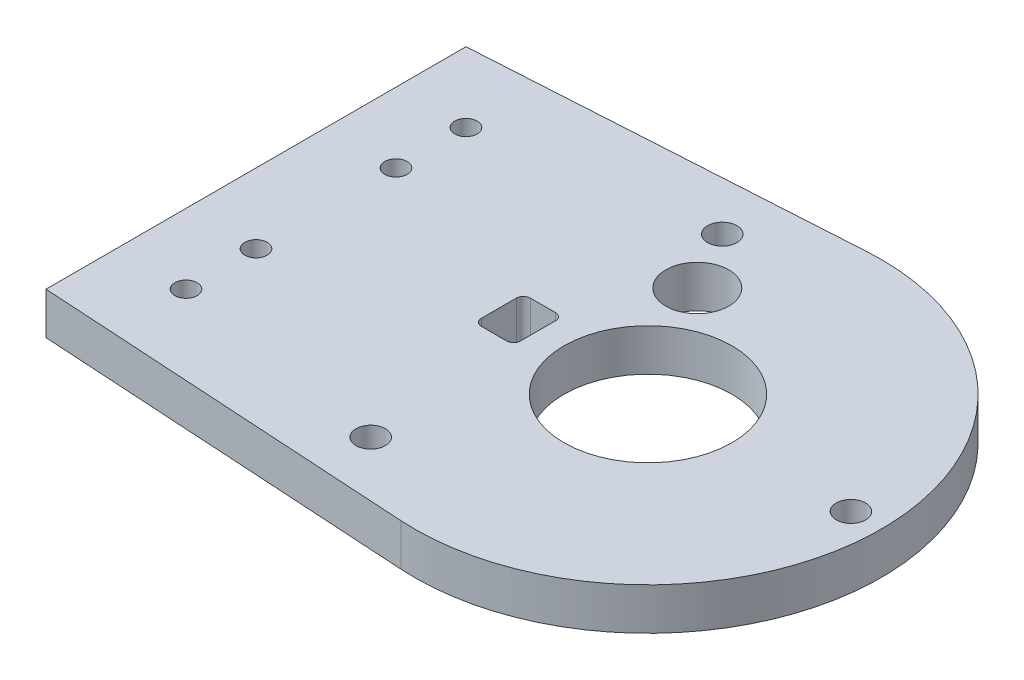
ISO-10303-21;
HEADER;
FILE_DESCRIPTION(('STEP AP214'),'2;1');
FILE_NAME('part.step','',(''),(''),'','','');
FILE_SCHEMA(('AUTOMOTIVE_DESIGN { 1 0 10303 214 1 1 1 1 }'));
ENDSEC;
DATA;
#1=APPLICATION_CONTEXT('core data for automotive mechanical design processes');
#2=APPLICATION_PROTOCOL_DEFINITION('international standard','automotive_design',2000,#1);
#3=PRODUCT_CONTEXT('',#1,'mechanical');
#4=PRODUCT('Part','Part','',(#3));
#5=PRODUCT_RELATED_PRODUCT_CATEGORY('part','',(#4));
#6=PRODUCT_DEFINITION_FORMATION('','',#4);
#7=PRODUCT_DEFINITION_CONTEXT('part definition',#1,'design');
#8=PRODUCT_DEFINITION('design','',#6,#7);
#9=PRODUCT_DEFINITION_SHAPE('','',#8);
#10=(LENGTH_UNIT() NAMED_UNIT(*) SI_UNIT(.MILLI.,.METRE.));
#11=(NAMED_UNIT(*) PLANE_ANGLE_UNIT() SI_UNIT($,.RADIAN.));
#12=(NAMED_UNIT(*) SI_UNIT($,.STERADIAN.) SOLID_ANGLE_UNIT());
#13=UNCERTAINTY_MEASURE_WITH_UNIT(LENGTH_MEASURE(1.E-05),#10,'distance_accuracy_value','');
#14=(GEOMETRIC_REPRESENTATION_CONTEXT(3) GLOBAL_UNCERTAINTY_ASSIGNED_CONTEXT((#13)) GLOBAL_UNIT_ASSIGNED_CONTEXT((#10,
#11,#12)) REPRESENTATION_CONTEXT('',''));
#15=CARTESIAN_POINT('',(0.,0.,0.));
#16=DIRECTION('',(0.,0.,1.));
#17=DIRECTION('',(1.,0.,0.));
#18=AXIS2_PLACEMENT_3D('',#15,#16,#17);
#19=CARTESIAN_POINT('',(-56.,6.,30.));
#20=DIRECTION('',(0.0608129390413845,0.,-0.998149180456082));
#21=DIRECTION('',(-0.998149180456082,0.,-0.0608129390413845));
#22=AXIS2_PLACEMENT_3D('',#19,#20,#21);
#23=PLANE('',#22);
#24=DIRECTION('',(0.998149180456082,0.,0.0608129390413845));
#25=VECTOR('',#24,1.);
#26=CARTESIAN_POINT('',(-56.,0.,30.));
#27=LINE('',#26,#25);
#28=CARTESIAN_POINT('',(-56.,0.,30.));
#29=VERTEX_POINT('',#28);
#30=CARTESIAN_POINT('',(-2.02811151703019,0.,33.2882751682104));
#31=VERTEX_POINT('',#30);
#32=EDGE_CURVE('E158',#29,#31,#27,.T.);
#33=ORIENTED_EDGE('',*,*,#32,.T.);
#34=DIRECTION('',(0.,-1.,0.));
#35=VECTOR('',#34,1.);
#36=CARTESIAN_POINT('',(-2.02811151703019,6.,33.2882751682104));
#37=LINE('',#36,#35);
#38=CARTESIAN_POINT('',(-2.02811151703019,6.,33.2882751682104));
#39=VERTEX_POINT('',#38);
#40=EDGE_CURVE('E137',#39,#31,#37,.T.);
#41=ORIENTED_EDGE('',*,*,#40,.F.);
#42=DIRECTION('',(0.998149180456082,0.,0.0608129390413845));
#43=VECTOR('',#42,1.);
#44=CARTESIAN_POINT('',(-56.,6.,30.));
#45=LINE('',#44,#43);
#46=CARTESIAN_POINT('',(-56.,6.,30.));
#47=VERTEX_POINT('',#46);
#48=EDGE_CURVE('E145',#47,#39,#45,.T.);
#49=ORIENTED_EDGE('',*,*,#48,.F.);
#50=DIRECTION('',(0.,-1.,0.));
#51=VECTOR('',#50,1.);
#52=CARTESIAN_POINT('',(-56.,6.,30.));
#53=LINE('',#52,#51);
#54=EDGE_CURVE('E319',#47,#29,#53,.T.);
#55=ORIENTED_EDGE('',*,*,#54,.T.);
#56=EDGE_LOOP('',(#33,#41,#49,#55));
#57=FACE_BOUND('',#56,.T.);
#58=ADVANCED_FACE('F43',(#57),#23,.F.);
#59=CARTESIAN_POINT('',(0.,6.,0.));
#60=DIRECTION('',(0.,-1.,0.));
#61=DIRECTION('',(0.,0.,-1.));
#62=AXIS2_PLACEMENT_3D('',#59,#60,#61);
#63=CYLINDRICAL_SURFACE('',#62,33.35);
#64=CARTESIAN_POINT('',(0.,0.,0.));
#65=DIRECTION('',(0.,1.,0.));
#66=DIRECTION('',(0.,0.,-1.));
#67=AXIS2_PLACEMENT_3D('',#64,#65,#66);
#68=CIRCLE('',#67,33.35);
#69=CARTESIAN_POINT('',(-2.02811151703017,0.,-33.2882751682103));
#70=VERTEX_POINT('',#69);
#71=EDGE_CURVE('E322',#31,#70,#68,.T.);
#72=ORIENTED_EDGE('',*,*,#71,.T.);
#73=DIRECTION('',(0.,-1.,0.));
#74=VECTOR('',#73,1.);
#75=CARTESIAN_POINT('',(-2.02811151703017,6.,-33.2882751682103));
#76=LINE('',#75,#74);
#77=CARTESIAN_POINT('',(-2.02811151703017,6.,-33.2882751682103));
#78=VERTEX_POINT('',#77);
#79=EDGE_CURVE('E140',#78,#70,#76,.T.);
#80=ORIENTED_EDGE('',*,*,#79,.F.);
#81=CARTESIAN_POINT('',(0.,6.,0.));
#82=DIRECTION('',(0.,1.,0.));
#83=DIRECTION('',(0.,0.,-1.));
#84=AXIS2_PLACEMENT_3D('',#81,#82,#83);
#85=CIRCLE('',#84,33.35);
#86=EDGE_CURVE('E133',#39,#78,#85,.T.);
#87=ORIENTED_EDGE('',*,*,#86,.F.);
#88=ORIENTED_EDGE('',*,*,#40,.T.);
#89=EDGE_LOOP('',(#72,#80,#87,#88));
#90=FACE_BOUND('',#89,.T.);
#91=ADVANCED_FACE('F135',(#90),#63,.T.);
#92=CARTESIAN_POINT('',(-2.02811151703017,6.,-33.2882751682103));
#93=DIRECTION('',(0.0608129390413845,0.,0.998149180456082));
#94=DIRECTION('',(0.998149180456082,0.,-0.0608129390413845));
#95=AXIS2_PLACEMENT_3D('',#92,#93,#94);
#96=PLANE('',#95);
#97=DIRECTION('',(-0.998149180456082,0.,0.0608129390413845));
#98=VECTOR('',#97,1.);
#99=CARTESIAN_POINT('',(-2.02811151703017,0.,-33.2882751682103));
#100=LINE('',#99,#98);
#101=CARTESIAN_POINT('',(-56.,0.,-30.));
#102=VERTEX_POINT('',#101);
#103=EDGE_CURVE('E325',#70,#102,#100,.T.);
#104=ORIENTED_EDGE('',*,*,#103,.T.);
#105=DIRECTION('',(0.,-1.,0.));
#106=VECTOR('',#105,1.);
#107=CARTESIAN_POINT('',(-56.,6.,-30.));
#108=LINE('',#107,#106);
#109=CARTESIAN_POINT('',(-56.,6.,-30.));
#110=VERTEX_POINT('',#109);
#111=EDGE_CURVE('E166',#110,#102,#108,.T.);
#112=ORIENTED_EDGE('',*,*,#111,.F.);
#113=DIRECTION('',(-0.998149180456082,0.,0.0608129390413845));
#114=VECTOR('',#113,1.);
#115=CARTESIAN_POINT('',(-2.02811151703017,6.,-33.2882751682103));
#116=LINE('',#115,#114);
#117=EDGE_CURVE('E144',#78,#110,#116,.T.);
#118=ORIENTED_EDGE('',*,*,#117,.F.);
#119=ORIENTED_EDGE('',*,*,#79,.T.);
#120=EDGE_LOOP('',(#104,#112,#118,#119));
#121=FACE_BOUND('',#120,.T.);
#122=ADVANCED_FACE('F341',(#121),#96,.F.);
#123=CARTESIAN_POINT('',(-56.,6.,30.));
#124=DIRECTION('',(1.,0.,0.));
#125=DIRECTION('',(0.,0.,-1.));
#126=AXIS2_PLACEMENT_3D('',#123,#124,#125);
#127=PLANE('',#126);
#128=DIRECTION('',(0.,0.,1.));
#129=VECTOR('',#128,1.);
#130=CARTESIAN_POINT('',(-56.,0.,30.));
#131=LINE('',#130,#129);
#132=EDGE_CURVE('E155',#102,#29,#131,.T.);
#133=ORIENTED_EDGE('',*,*,#132,.T.);
#134=ORIENTED_EDGE('',*,*,#54,.F.);
#135=DIRECTION('',(0.,0.,1.));
#136=VECTOR('',#135,1.);
#137=CARTESIAN_POINT('',(-56.,6.,30.));
#138=LINE('',#137,#136);
#139=EDGE_CURVE('E150',#110,#47,#138,.T.);
#140=ORIENTED_EDGE('',*,*,#139,.F.);
#141=ORIENTED_EDGE('',*,*,#111,.T.);
#142=EDGE_LOOP('',(#133,#134,#140,#141));
#143=FACE_BOUND('',#142,.T.);
#144=ADVANCED_FACE('F336',(#143),#127,.F.);
#145=CARTESIAN_POINT('',(0.,6.,0.));
#146=DIRECTION('',(0.,-1.,0.));
#147=DIRECTION('',(0.,0.,-1.));
#148=AXIS2_PLACEMENT_3D('',#145,#146,#147);
#149=PLANE('',#148);
#150=DIRECTION('',(0.,0.,-1.));
#151=VECTOR('',#150,1.);
#152=CARTESIAN_POINT('',(-15.7,6.,3.5));
#153=LINE('',#152,#151);
#154=CARTESIAN_POINT('',(-15.7,6.,2.5));
#155=VERTEX_POINT('',#154);
#156=CARTESIAN_POINT('',(-15.7,6.,-2.5));
#157=VERTEX_POINT('',#156);
#158=EDGE_CURVE('E216',#155,#157,#153,.T.);
#159=ORIENTED_EDGE('',*,*,#158,.F.);
#160=CARTESIAN_POINT('',(-16.7,6.,2.5));
#161=DIRECTION('',(0.,-1.,0.));
#162=DIRECTION('',(0.,0.,-1.));
#163=AXIS2_PLACEMENT_3D('',#160,#161,#162);
#164=CIRCLE('',#163,1.);
#165=CARTESIAN_POINT('',(-16.7,6.,3.5));
#166=VERTEX_POINT('',#165);
#167=EDGE_CURVE('E193',#155,#166,#164,.T.);
#168=ORIENTED_EDGE('',*,*,#167,.T.);
#169=DIRECTION('',(1.,0.,0.));
#170=VECTOR('',#169,1.);
#171=CARTESIAN_POINT('',(-15.7,6.,3.5));
#172=LINE('',#171,#170);
#173=CARTESIAN_POINT('',(-20.3,6.,3.5));
#174=VERTEX_POINT('',#173);
#175=EDGE_CURVE('E226',#174,#166,#172,.T.);
#176=ORIENTED_EDGE('',*,*,#175,.F.);
#177=CARTESIAN_POINT('',(-20.3,6.,2.5));
#178=DIRECTION('',(0.,-1.,0.));
#179=DIRECTION('',(0.,0.,-1.));
#180=AXIS2_PLACEMENT_3D('',#177,#178,#179);
#181=CIRCLE('',#180,1.);
#182=CARTESIAN_POINT('',(-21.3,6.,2.5));
#183=VERTEX_POINT('',#182);
#184=EDGE_CURVE('E199',#174,#183,#181,.T.);
#185=ORIENTED_EDGE('',*,*,#184,.T.);
#186=DIRECTION('',(0.,0.,1.));
#187=VECTOR('',#186,1.);
#188=CARTESIAN_POINT('',(-21.3,6.,3.5));
#189=LINE('',#188,#187);
#190=CARTESIAN_POINT('',(-21.3,6.,-2.5));
#191=VERTEX_POINT('',#190);
#192=EDGE_CURVE('E377',#191,#183,#189,.T.);
#193=ORIENTED_EDGE('',*,*,#192,.F.);
#194=CARTESIAN_POINT('',(-20.3,6.,-2.5));
#195=DIRECTION('',(0.,-1.,0.));
#196=DIRECTION('',(0.,0.,-1.));
#197=AXIS2_PLACEMENT_3D('',#194,#195,#196);
#198=CIRCLE('',#197,1.);
#199=CARTESIAN_POINT('',(-20.3,6.,-3.5));
#200=VERTEX_POINT('',#199);
#201=EDGE_CURVE('E205',#191,#200,#198,.T.);
#202=ORIENTED_EDGE('',*,*,#201,.T.);
#203=DIRECTION('',(-1.,0.,0.));
#204=VECTOR('',#203,1.);
#205=CARTESIAN_POINT('',(-15.7,6.,-3.5));
#206=LINE('',#205,#204);
#207=CARTESIAN_POINT('',(-16.7,6.,-3.5));
#208=VERTEX_POINT('',#207);
#209=EDGE_CURVE('E217',#208,#200,#206,.T.);
#210=ORIENTED_EDGE('',*,*,#209,.F.);
#211=CARTESIAN_POINT('',(-16.7,6.,-2.5));
#212=DIRECTION('',(0.,-1.,0.));
#213=DIRECTION('',(0.,0.,-1.));
#214=AXIS2_PLACEMENT_3D('',#211,#212,#213);
#215=CIRCLE('',#214,1.);
#216=EDGE_CURVE('E52',#208,#157,#215,.T.);
#217=ORIENTED_EDGE('',*,*,#216,.T.);
#218=EDGE_LOOP('',(#159,#168,#176,#185,#193,#202,#210,#217));
#219=FACE_BOUND('',#218,.T.);
#220=CARTESIAN_POINT('',(-14.5,6.,-25.1147367097487));
#221=DIRECTION('',(0.,1.,0.));
#222=DIRECTION('',(0.,0.,1.));
#223=AXIS2_PLACEMENT_3D('',#220,#221,#222);
#224=CIRCLE('',#223,2.1);
#225=CARTESIAN_POINT('',(-14.5,6.,-23.0147367097487));
#226=VERTEX_POINT('',#225);
#227=EDGE_CURVE('E258',#226,#226,#224,.T.);
#228=ORIENTED_EDGE('',*,*,#227,.F.);
#229=EDGE_LOOP('',(#228));
#230=FACE_BOUND('',#229,.T.);
#231=CARTESIAN_POINT('',(-14.5,6.,25.1147367097487));
#232=DIRECTION('',(0.,1.,0.));
#233=DIRECTION('',(0.,0.,1.));
#234=AXIS2_PLACEMENT_3D('',#231,#232,#233);
#235=CIRCLE('',#234,2.1);
#236=CARTESIAN_POINT('',(-14.5,6.,27.2147367097487));
#237=VERTEX_POINT('',#236);
#238=EDGE_CURVE('E249',#237,#237,#235,.T.);
#239=ORIENTED_EDGE('',*,*,#238,.F.);
#240=EDGE_LOOP('',(#239));
#241=FACE_BOUND('',#240,.T.);
#242=CARTESIAN_POINT('',(29.,6.,0.));
#243=DIRECTION('',(0.,1.,0.));
#244=DIRECTION('',(0.,0.,1.));
#245=AXIS2_PLACEMENT_3D('',#242,#243,#244);
#246=CIRCLE('',#245,2.1);
#247=CARTESIAN_POINT('',(29.,6.,2.1));
#248=VERTEX_POINT('',#247);
#249=EDGE_CURVE('E248',#248,#248,#246,.T.);
#250=ORIENTED_EDGE('',*,*,#249,.F.);
#251=EDGE_LOOP('',(#250));
#252=FACE_BOUND('',#251,.T.);
#253=CARTESIAN_POINT('',(-9.62500000000001,6.,-16.6709890228504));
#254=DIRECTION('',(0.,1.,0.));
#255=DIRECTION('',(0.,0.,1.));
#256=AXIS2_PLACEMENT_3D('',#253,#254,#255);
#257=CIRCLE('',#256,4.5);
#258=CARTESIAN_POINT('',(-9.62500000000001,6.,-12.1709890228504));
#259=VERTEX_POINT('',#258);
#260=EDGE_CURVE('E253',#259,#259,#257,.T.);
#261=ORIENTED_EDGE('',*,*,#260,.F.);
#262=EDGE_LOOP('',(#261));
#263=FACE_BOUND('',#262,.T.);
#264=CARTESIAN_POINT('',(-46.,6.,-20.));
#265=DIRECTION('',(0.,1.,0.));
#266=DIRECTION('',(0.,0.,1.));
#267=AXIS2_PLACEMENT_3D('',#264,#265,#266);
#268=CIRCLE('',#267,1.6);
#269=CARTESIAN_POINT('',(-46.,6.,-18.4));
#270=VERTEX_POINT('',#269);
#271=EDGE_CURVE('E276',#270,#270,#268,.T.);
#272=ORIENTED_EDGE('',*,*,#271,.F.);
#273=EDGE_LOOP('',(#272));
#274=FACE_BOUND('',#273,.T.);
#275=CARTESIAN_POINT('',(-46.,6.,10.));
#276=DIRECTION('',(0.,1.,0.));
#277=DIRECTION('',(0.,0.,-1.));
#278=AXIS2_PLACEMENT_3D('',#275,#276,#277);
#279=CIRCLE('',#278,1.6);
#280=CARTESIAN_POINT('',(-46.,6.,8.4));
#281=VERTEX_POINT('',#280);
#282=EDGE_CURVE('E289',#281,#281,#279,.T.);
#283=ORIENTED_EDGE('',*,*,#282,.F.);
#284=EDGE_LOOP('',(#283));
#285=FACE_BOUND('',#284,.T.);
#286=CARTESIAN_POINT('',(-46.,6.,20.));
#287=DIRECTION('',(0.,1.,0.));
#288=DIRECTION('',(0.,0.,-1.));
#289=AXIS2_PLACEMENT_3D('',#286,#287,#288);
#290=CIRCLE('',#289,1.6);
#291=CARTESIAN_POINT('',(-46.,6.,18.4));
#292=VERTEX_POINT('',#291);
#293=EDGE_CURVE('E298',#292,#292,#290,.T.);
#294=ORIENTED_EDGE('',*,*,#293,.F.);
#295=EDGE_LOOP('',(#294));
#296=FACE_BOUND('',#295,.T.);
#297=CARTESIAN_POINT('',(-46.,6.,-10.));
#298=DIRECTION('',(0.,1.,0.));
#299=DIRECTION('',(0.,0.,1.));
#300=AXIS2_PLACEMENT_3D('',#297,#298,#299);
#301=CIRCLE('',#300,1.6);
#302=CARTESIAN_POINT('',(-46.,6.,-8.4));
#303=VERTEX_POINT('',#302);
#304=EDGE_CURVE('E281',#303,#303,#301,.T.);
#305=ORIENTED_EDGE('',*,*,#304,.F.);
#306=EDGE_LOOP('',(#305));
#307=FACE_BOUND('',#306,.T.);
#308=CARTESIAN_POINT('',(0.,6.,0.));
#309=DIRECTION('',(0.,1.,0.));
#310=DIRECTION('',(0.,0.,1.));
#311=AXIS2_PLACEMENT_3D('',#308,#309,#310);
#312=CIRCLE('',#311,12.);
#313=CARTESIAN_POINT('',(0.,6.,12.));
#314=VERTEX_POINT('',#313);
#315=EDGE_CURVE('E285',#314,#314,#312,.T.);
#316=ORIENTED_EDGE('',*,*,#315,.F.);
#317=EDGE_LOOP('',(#316));
#318=FACE_BOUND('',#317,.T.);
#319=ORIENTED_EDGE('',*,*,#48,.T.);
#320=ORIENTED_EDGE('',*,*,#86,.T.);
#321=ORIENTED_EDGE('',*,*,#117,.T.);
#322=ORIENTED_EDGE('',*,*,#139,.T.);
#323=EDGE_LOOP('',(#319,#320,#321,#322));
#324=FACE_BOUND('',#323,.T.);
#325=ADVANCED_FACE('F148',(#219,#230,#241,#252,#263,#274,#285,#296,#307,#318,#324),#149,.F.);
#326=CARTESIAN_POINT('',(0.,0.,0.));
#327=DIRECTION('',(0.,-1.,0.));
#328=DIRECTION('',(0.,0.,-1.));
#329=AXIS2_PLACEMENT_3D('',#326,#327,#328);
#330=PLANE('',#329);
#331=DIRECTION('',(0.,0.,1.));
#332=VECTOR('',#331,1.);
#333=CARTESIAN_POINT('',(-21.3,0.,3.5));
#334=LINE('',#333,#332);
#335=CARTESIAN_POINT('',(-21.3,0.,-2.5));
#336=VERTEX_POINT('',#335);
#337=CARTESIAN_POINT('',(-21.3,0.,2.5));
#338=VERTEX_POINT('',#337);
#339=EDGE_CURVE('E232',#336,#338,#334,.T.);
#340=ORIENTED_EDGE('',*,*,#339,.T.);
#341=CARTESIAN_POINT('',(-20.3,0.,2.5));
#342=DIRECTION('',(0.,-1.,0.));
#343=DIRECTION('',(0.,0.,-1.));
#344=AXIS2_PLACEMENT_3D('',#341,#342,#343);
#345=CIRCLE('',#344,1.);
#346=CARTESIAN_POINT('',(-20.3,0.,3.5));
#347=VERTEX_POINT('',#346);
#348=EDGE_CURVE('E202',#338,#347,#345,.F.);
#349=ORIENTED_EDGE('',*,*,#348,.T.);
#350=DIRECTION('',(1.,0.,0.));
#351=VECTOR('',#350,1.);
#352=CARTESIAN_POINT('',(-15.7,0.,3.5));
#353=LINE('',#352,#351);
#354=CARTESIAN_POINT('',(-16.7,0.,3.5));
#355=VERTEX_POINT('',#354);
#356=EDGE_CURVE('E240',#347,#355,#353,.T.);
#357=ORIENTED_EDGE('',*,*,#356,.T.);
#358=CARTESIAN_POINT('',(-16.7,0.,2.5));
#359=DIRECTION('',(0.,-1.,0.));
#360=DIRECTION('',(0.,0.,-1.));
#361=AXIS2_PLACEMENT_3D('',#358,#359,#360);
#362=CIRCLE('',#361,1.);
#363=CARTESIAN_POINT('',(-15.7,0.,2.5));
#364=VERTEX_POINT('',#363);
#365=EDGE_CURVE('E196',#355,#364,#362,.F.);
#366=ORIENTED_EDGE('',*,*,#365,.T.);
#367=DIRECTION('',(0.,0.,-1.));
#368=VECTOR('',#367,1.);
#369=CARTESIAN_POINT('',(-15.7,0.,3.5));
#370=LINE('',#369,#368);
#371=CARTESIAN_POINT('',(-15.7,0.,-2.5));
#372=VERTEX_POINT('',#371);
#373=EDGE_CURVE('E233',#364,#372,#370,.T.);
#374=ORIENTED_EDGE('',*,*,#373,.T.);
#375=CARTESIAN_POINT('',(-16.7,0.,-2.5));
#376=DIRECTION('',(0.,-1.,0.));
#377=DIRECTION('',(0.,0.,-1.));
#378=AXIS2_PLACEMENT_3D('',#375,#376,#377);
#379=CIRCLE('',#378,1.);
#380=CARTESIAN_POINT('',(-16.7,0.,-3.5));
#381=VERTEX_POINT('',#380);
#382=EDGE_CURVE('E11',#372,#381,#379,.F.);
#383=ORIENTED_EDGE('',*,*,#382,.T.);
#384=DIRECTION('',(-1.,0.,0.));
#385=VECTOR('',#384,1.);
#386=CARTESIAN_POINT('',(-15.7,0.,-3.5));
#387=LINE('',#386,#385);
#388=CARTESIAN_POINT('',(-20.3,0.,-3.5));
#389=VERTEX_POINT('',#388);
#390=EDGE_CURVE('E229',#381,#389,#387,.T.);
#391=ORIENTED_EDGE('',*,*,#390,.T.);
#392=CARTESIAN_POINT('',(-20.3,0.,-2.5));
#393=DIRECTION('',(0.,-1.,0.));
#394=DIRECTION('',(0.,0.,-1.));
#395=AXIS2_PLACEMENT_3D('',#392,#393,#394);
#396=CIRCLE('',#395,1.);
#397=EDGE_CURVE('E208',#389,#336,#396,.F.);
#398=ORIENTED_EDGE('',*,*,#397,.T.);
#399=EDGE_LOOP('',(#340,#349,#357,#366,#374,#383,#391,#398));
#400=FACE_BOUND('',#399,.T.);
#401=CARTESIAN_POINT('',(-14.5,0.,-25.1147367097487));
#402=DIRECTION('',(0.,-1.,0.));
#403=DIRECTION('',(0.,0.,-1.));
#404=AXIS2_PLACEMENT_3D('',#401,#402,#403);
#405=CIRCLE('',#404,2.1);
#406=CARTESIAN_POINT('',(-14.5,0.,-27.2147367097487));
#407=VERTEX_POINT('',#406);
#408=EDGE_CURVE('E238',#407,#407,#405,.F.);
#409=ORIENTED_EDGE('',*,*,#408,.T.);
#410=EDGE_LOOP('',(#409));
#411=FACE_BOUND('',#410,.T.);
#412=CARTESIAN_POINT('',(-14.5,0.,25.1147367097487));
#413=DIRECTION('',(0.,-1.,0.));
#414=DIRECTION('',(0.,0.,-1.));
#415=AXIS2_PLACEMENT_3D('',#412,#413,#414);
#416=CIRCLE('',#415,2.1);
#417=CARTESIAN_POINT('',(-14.5,0.,23.0147367097487));
#418=VERTEX_POINT('',#417);
#419=EDGE_CURVE('E254',#418,#418,#416,.F.);
#420=ORIENTED_EDGE('',*,*,#419,.T.);
#421=EDGE_LOOP('',(#420));
#422=FACE_BOUND('',#421,.T.);
#423=CARTESIAN_POINT('',(29.,0.,0.));
#424=DIRECTION('',(0.,-1.,0.));
#425=DIRECTION('',(0.,0.,-1.));
#426=AXIS2_PLACEMENT_3D('',#423,#424,#425);
#427=CIRCLE('',#426,2.1);
#428=CARTESIAN_POINT('',(29.,0.,-2.1));
#429=VERTEX_POINT('',#428);
#430=EDGE_CURVE('E244',#429,#429,#427,.F.);
#431=ORIENTED_EDGE('',*,*,#430,.T.);
#432=EDGE_LOOP('',(#431));
#433=FACE_BOUND('',#432,.T.);
#434=CARTESIAN_POINT('',(-9.62500000000001,0.,-16.6709890228504));
#435=DIRECTION('',(0.,-1.,0.));
#436=DIRECTION('',(0.,0.,-1.));
#437=AXIS2_PLACEMENT_3D('',#434,#435,#436);
#438=CIRCLE('',#437,4.5);
#439=CARTESIAN_POINT('',(-9.62500000000001,0.,-21.1709890228504));
#440=VERTEX_POINT('',#439);
#441=EDGE_CURVE('E271',#440,#440,#438,.F.);
#442=ORIENTED_EDGE('',*,*,#441,.T.);
#443=EDGE_LOOP('',(#442));
#444=FACE_BOUND('',#443,.T.);
#445=CARTESIAN_POINT('',(-46.,0.,-20.));
#446=DIRECTION('',(0.,-1.,0.));
#447=DIRECTION('',(0.,0.,-1.));
#448=AXIS2_PLACEMENT_3D('',#445,#446,#447);
#449=CIRCLE('',#448,1.6);
#450=CARTESIAN_POINT('',(-46.,0.,-21.6));
#451=VERTEX_POINT('',#450);
#452=EDGE_CURVE('E280',#451,#451,#449,.F.);
#453=ORIENTED_EDGE('',*,*,#452,.T.);
#454=EDGE_LOOP('',(#453));
#455=FACE_BOUND('',#454,.T.);
#456=CARTESIAN_POINT('',(-46.,0.,10.));
#457=DIRECTION('',(0.,-1.,0.));
#458=DIRECTION('',(0.,0.,-1.));
#459=AXIS2_PLACEMENT_3D('',#456,#457,#458);
#460=CIRCLE('',#459,1.6);
#461=CARTESIAN_POINT('',(-46.,0.,8.4));
#462=VERTEX_POINT('',#461);
#463=EDGE_CURVE('E275',#462,#462,#460,.F.);
#464=ORIENTED_EDGE('',*,*,#463,.T.);
#465=EDGE_LOOP('',(#464));
#466=FACE_BOUND('',#465,.T.);
#467=CARTESIAN_POINT('',(-46.,0.,20.));
#468=DIRECTION('',(0.,-1.,0.));
#469=DIRECTION('',(0.,0.,-1.));
#470=AXIS2_PLACEMENT_3D('',#467,#468,#469);
#471=CIRCLE('',#470,1.6);
#472=CARTESIAN_POINT('',(-46.,0.,18.4));
#473=VERTEX_POINT('',#472);
#474=EDGE_CURVE('E293',#473,#473,#471,.F.);
#475=ORIENTED_EDGE('',*,*,#474,.T.);
#476=EDGE_LOOP('',(#475));
#477=FACE_BOUND('',#476,.T.);
#478=CARTESIAN_POINT('',(-46.,0.,-10.));
#479=DIRECTION('',(0.,-1.,0.));
#480=DIRECTION('',(0.,0.,-1.));
#481=AXIS2_PLACEMENT_3D('',#478,#479,#480);
#482=CIRCLE('',#481,1.6);
#483=CARTESIAN_POINT('',(-46.,0.,-11.6));
#484=VERTEX_POINT('',#483);
#485=EDGE_CURVE('E294',#484,#484,#482,.F.);
#486=ORIENTED_EDGE('',*,*,#485,.T.);
#487=EDGE_LOOP('',(#486));
#488=FACE_BOUND('',#487,.T.);
#489=CARTESIAN_POINT('',(0.,0.,0.));
#490=DIRECTION('',(0.,-1.,0.));
#491=DIRECTION('',(0.,0.,-1.));
#492=AXIS2_PLACEMENT_3D('',#489,#490,#491);
#493=CIRCLE('',#492,12.);
#494=CARTESIAN_POINT('',(0.,0.,-12.));
#495=VERTEX_POINT('',#494);
#496=EDGE_CURVE('E311',#495,#495,#493,.F.);
#497=ORIENTED_EDGE('',*,*,#496,.T.);
#498=EDGE_LOOP('',(#497));
#499=FACE_BOUND('',#498,.T.);
#500=ORIENTED_EDGE('',*,*,#32,.F.);
#501=ORIENTED_EDGE('',*,*,#132,.F.);
#502=ORIENTED_EDGE('',*,*,#103,.F.);
#503=ORIENTED_EDGE('',*,*,#71,.F.);
#504=EDGE_LOOP('',(#500,#501,#502,#503));
#505=FACE_BOUND('',#504,.T.);
#506=ADVANCED_FACE('F340',(#400,#411,#422,#433,#444,#455,#466,#477,#488,#499,#505),#330,.T.);
#507=CARTESIAN_POINT('',(0.,-33.9411254969543,0.));
#508=DIRECTION('',(0.,1.,0.));
#509=DIRECTION('',(0.,0.,1.));
#510=AXIS2_PLACEMENT_3D('',#507,#508,#509);
#511=CYLINDRICAL_SURFACE('',#510,12.);
#512=ORIENTED_EDGE('',*,*,#315,.T.);
#513=EDGE_LOOP('',(#512));
#514=FACE_BOUND('',#513,.T.);
#515=ORIENTED_EDGE('',*,*,#496,.F.);
#516=EDGE_LOOP('',(#515));
#517=FACE_BOUND('',#516,.T.);
#518=ADVANCED_FACE('F430',(#514,#517),#511,.F.);
#519=CARTESIAN_POINT('',(-46.,-4.5254833995939,-10.));
#520=DIRECTION('',(0.,1.,0.));
#521=DIRECTION('',(0.,0.,1.));
#522=AXIS2_PLACEMENT_3D('',#519,#520,#521);
#523=CYLINDRICAL_SURFACE('',#522,1.6);
#524=ORIENTED_EDGE('',*,*,#304,.T.);
#525=EDGE_LOOP('',(#524));
#526=FACE_BOUND('',#525,.T.);
#527=ORIENTED_EDGE('',*,*,#485,.F.);
#528=EDGE_LOOP('',(#527));
#529=FACE_BOUND('',#528,.T.);
#530=ADVANCED_FACE('F427',(#526,#529),#523,.F.);
#531=CARTESIAN_POINT('',(-46.,-4.5254833995939,20.));
#532=DIRECTION('',(0.,1.,0.));
#533=DIRECTION('',(0.,0.,1.));
#534=AXIS2_PLACEMENT_3D('',#531,#532,#533);
#535=CYLINDRICAL_SURFACE('',#534,1.6);
#536=ORIENTED_EDGE('',*,*,#293,.T.);
#537=EDGE_LOOP('',(#536));
#538=FACE_BOUND('',#537,.T.);
#539=ORIENTED_EDGE('',*,*,#474,.F.);
#540=EDGE_LOOP('',(#539));
#541=FACE_BOUND('',#540,.T.);
#542=ADVANCED_FACE('F425',(#538,#541),#535,.F.);
#543=CARTESIAN_POINT('',(-46.,-4.5254833995939,10.));
#544=DIRECTION('',(0.,1.,0.));
#545=DIRECTION('',(0.,0.,1.));
#546=AXIS2_PLACEMENT_3D('',#543,#544,#545);
#547=CYLINDRICAL_SURFACE('',#546,1.6);
#548=ORIENTED_EDGE('',*,*,#282,.T.);
#549=EDGE_LOOP('',(#548));
#550=FACE_BOUND('',#549,.T.);
#551=ORIENTED_EDGE('',*,*,#463,.F.);
#552=EDGE_LOOP('',(#551));
#553=FACE_BOUND('',#552,.T.);
#554=ADVANCED_FACE('F421',(#550,#553),#547,.F.);
#555=CARTESIAN_POINT('',(-46.,-4.5254833995939,-20.));
#556=DIRECTION('',(0.,1.,0.));
#557=DIRECTION('',(0.,0.,1.));
#558=AXIS2_PLACEMENT_3D('',#555,#556,#557);
#559=CYLINDRICAL_SURFACE('',#558,1.6);
#560=ORIENTED_EDGE('',*,*,#271,.T.);
#561=EDGE_LOOP('',(#560));
#562=FACE_BOUND('',#561,.T.);
#563=ORIENTED_EDGE('',*,*,#452,.F.);
#564=EDGE_LOOP('',(#563));
#565=FACE_BOUND('',#564,.T.);
#566=ADVANCED_FACE('F417',(#562,#565),#559,.F.);
#567=CARTESIAN_POINT('',(-9.62500000000001,-12.7279220613579,-16.6709890228504));
#568=DIRECTION('',(0.,1.,0.));
#569=DIRECTION('',(0.,0.,1.));
#570=AXIS2_PLACEMENT_3D('',#567,#568,#569);
#571=CYLINDRICAL_SURFACE('',#570,4.5);
#572=ORIENTED_EDGE('',*,*,#260,.T.);
#573=EDGE_LOOP('',(#572));
#574=FACE_BOUND('',#573,.T.);
#575=ORIENTED_EDGE('',*,*,#441,.F.);
#576=EDGE_LOOP('',(#575));
#577=FACE_BOUND('',#576,.T.);
#578=ADVANCED_FACE('F410',(#574,#577),#571,.F.);
#579=CARTESIAN_POINT('',(29.,-12.7279220613579,0.));
#580=DIRECTION('',(0.,1.,0.));
#581=DIRECTION('',(0.,0.,1.));
#582=AXIS2_PLACEMENT_3D('',#579,#580,#581);
#583=CYLINDRICAL_SURFACE('',#582,2.1);
#584=ORIENTED_EDGE('',*,*,#249,.T.);
#585=EDGE_LOOP('',(#584));
#586=FACE_BOUND('',#585,.T.);
#587=ORIENTED_EDGE('',*,*,#430,.F.);
#588=EDGE_LOOP('',(#587));
#589=FACE_BOUND('',#588,.T.);
#590=ADVANCED_FACE('F407',(#586,#589),#583,.F.);
#591=CARTESIAN_POINT('',(-14.5,-12.7279220613579,25.1147367097487));
#592=DIRECTION('',(0.,1.,0.));
#593=DIRECTION('',(0.,0.,1.));
#594=AXIS2_PLACEMENT_3D('',#591,#592,#593);
#595=CYLINDRICAL_SURFACE('',#594,2.1);
#596=ORIENTED_EDGE('',*,*,#238,.T.);
#597=EDGE_LOOP('',(#596));
#598=FACE_BOUND('',#597,.T.);
#599=ORIENTED_EDGE('',*,*,#419,.F.);
#600=EDGE_LOOP('',(#599));
#601=FACE_BOUND('',#600,.T.);
#602=ADVANCED_FACE('F402',(#598,#601),#595,.F.);
#603=CARTESIAN_POINT('',(-14.5,-12.7279220613579,-25.1147367097487));
#604=DIRECTION('',(0.,1.,0.));
#605=DIRECTION('',(0.,0.,1.));
#606=AXIS2_PLACEMENT_3D('',#603,#604,#605);
#607=CYLINDRICAL_SURFACE('',#606,2.1);
#608=ORIENTED_EDGE('',*,*,#227,.T.);
#609=EDGE_LOOP('',(#608));
#610=FACE_BOUND('',#609,.T.);
#611=ORIENTED_EDGE('',*,*,#408,.F.);
#612=EDGE_LOOP('',(#611));
#613=FACE_BOUND('',#612,.T.);
#614=ADVANCED_FACE('F395',(#610,#613),#607,.F.);
#615=CARTESIAN_POINT('',(-15.7,-8.96437393240599,3.5));
#616=DIRECTION('',(0.,0.,1.));
#617=DIRECTION('',(1.,0.,0.));
#618=AXIS2_PLACEMENT_3D('',#615,#616,#617);
#619=PLANE('',#618);
#620=ORIENTED_EDGE('',*,*,#175,.T.);
#621=DIRECTION('',(0.,1.,0.));
#622=VECTOR('',#621,1.);
#623=CARTESIAN_POINT('',(-16.7,0.,3.5));
#624=LINE('',#623,#622);
#625=EDGE_CURVE('E177',#166,#355,#624,.F.);
#626=ORIENTED_EDGE('',*,*,#625,.T.);
#627=ORIENTED_EDGE('',*,*,#356,.F.);
#628=DIRECTION('',(0.,1.,0.));
#629=VECTOR('',#628,1.);
#630=CARTESIAN_POINT('',(-20.3,6.,3.5));
#631=LINE('',#630,#629);
#632=EDGE_CURVE('E173',#347,#174,#631,.T.);
#633=ORIENTED_EDGE('',*,*,#632,.T.);
#634=EDGE_LOOP('',(#620,#626,#627,#633));
#635=FACE_BOUND('',#634,.T.);
#636=ADVANCED_FACE('F384',(#635),#619,.F.);
#637=CARTESIAN_POINT('',(-15.7,-8.96437393240599,3.5));
#638=DIRECTION('',(1.,0.,0.));
#639=DIRECTION('',(0.,0.,-1.));
#640=AXIS2_PLACEMENT_3D('',#637,#638,#639);
#641=PLANE('',#640);
#642=ORIENTED_EDGE('',*,*,#373,.F.);
#643=DIRECTION('',(0.,1.,0.));
#644=VECTOR('',#643,1.);
#645=CARTESIAN_POINT('',(-15.7,6.,2.5));
#646=LINE('',#645,#644);
#647=EDGE_CURVE('E164',#364,#155,#646,.T.);
#648=ORIENTED_EDGE('',*,*,#647,.T.);
#649=ORIENTED_EDGE('',*,*,#158,.T.);
#650=DIRECTION('',(0.,1.,0.));
#651=VECTOR('',#650,1.);
#652=CARTESIAN_POINT('',(-15.7,0.,-2.5));
#653=LINE('',#652,#651);
#654=EDGE_CURVE('E160',#157,#372,#653,.F.);
#655=ORIENTED_EDGE('',*,*,#654,.T.);
#656=EDGE_LOOP('',(#642,#648,#649,#655));
#657=FACE_BOUND('',#656,.T.);
#658=ADVANCED_FACE('F223',(#657),#641,.F.);
#659=CARTESIAN_POINT('',(-15.7,-8.96437393240599,-3.5));
#660=DIRECTION('',(0.,0.,-1.));
#661=DIRECTION('',(-1.,0.,0.));
#662=AXIS2_PLACEMENT_3D('',#659,#660,#661);
#663=PLANE('',#662);
#664=ORIENTED_EDGE('',*,*,#209,.T.);
#665=DIRECTION('',(0.,1.,0.));
#666=VECTOR('',#665,1.);
#667=CARTESIAN_POINT('',(-20.3,0.,-3.5));
#668=LINE('',#667,#666);
#669=EDGE_CURVE('E59',#200,#389,#668,.F.);
#670=ORIENTED_EDGE('',*,*,#669,.T.);
#671=ORIENTED_EDGE('',*,*,#390,.F.);
#672=DIRECTION('',(0.,1.,0.));
#673=VECTOR('',#672,1.);
#674=CARTESIAN_POINT('',(-16.7,6.,-3.5));
#675=LINE('',#674,#673);
#676=EDGE_CURVE('E187',#381,#208,#675,.T.);
#677=ORIENTED_EDGE('',*,*,#676,.T.);
#678=EDGE_LOOP('',(#664,#670,#671,#677));
#679=FACE_BOUND('',#678,.T.);
#680=ADVANCED_FACE('F228',(#679),#663,.F.);
#681=CARTESIAN_POINT('',(-21.3,-8.96437393240599,3.5));
#682=DIRECTION('',(-1.,0.,0.));
#683=DIRECTION('',(0.,0.,1.));
#684=AXIS2_PLACEMENT_3D('',#681,#682,#683);
#685=PLANE('',#684);
#686=ORIENTED_EDGE('',*,*,#192,.T.);
#687=DIRECTION('',(0.,1.,0.));
#688=VECTOR('',#687,1.);
#689=CARTESIAN_POINT('',(-21.3,0.,2.5));
#690=LINE('',#689,#688);
#691=EDGE_CURVE('E184',#183,#338,#690,.F.);
#692=ORIENTED_EDGE('',*,*,#691,.T.);
#693=ORIENTED_EDGE('',*,*,#339,.F.);
#694=DIRECTION('',(0.,1.,0.));
#695=VECTOR('',#694,1.);
#696=CARTESIAN_POINT('',(-21.3,6.,-2.5));
#697=LINE('',#696,#695);
#698=EDGE_CURVE('E180',#336,#191,#697,.T.);
#699=ORIENTED_EDGE('',*,*,#698,.T.);
#700=EDGE_LOOP('',(#686,#692,#693,#699));
#701=FACE_BOUND('',#700,.T.);
#702=ADVANCED_FACE('F359',(#701),#685,.F.);
#703=CARTESIAN_POINT('',(-16.7,-8.96437393240599,2.5));
#704=DIRECTION('',(0.,-1.,0.));
#705=DIRECTION('',(0.,0.,-1.));
#706=AXIS2_PLACEMENT_3D('',#703,#704,#705);
#707=CYLINDRICAL_SURFACE('',#706,1.);
#708=ORIENTED_EDGE('',*,*,#365,.F.);
#709=ORIENTED_EDGE('',*,*,#625,.F.);
#710=ORIENTED_EDGE('',*,*,#167,.F.);
#711=ORIENTED_EDGE('',*,*,#647,.F.);
#712=EDGE_LOOP('',(#708,#709,#710,#711));
#713=FACE_BOUND('',#712,.T.);
#714=ADVANCED_FACE('F355',(#713),#707,.F.);
#715=CARTESIAN_POINT('',(-20.3,-8.96437393240599,2.5));
#716=DIRECTION('',(0.,-1.,0.));
#717=DIRECTION('',(0.,0.,-1.));
#718=AXIS2_PLACEMENT_3D('',#715,#716,#717);
#719=CYLINDRICAL_SURFACE('',#718,1.);
#720=ORIENTED_EDGE('',*,*,#348,.F.);
#721=ORIENTED_EDGE('',*,*,#691,.F.);
#722=ORIENTED_EDGE('',*,*,#184,.F.);
#723=ORIENTED_EDGE('',*,*,#632,.F.);
#724=EDGE_LOOP('',(#720,#721,#722,#723));
#725=FACE_BOUND('',#724,.T.);
#726=ADVANCED_FACE('F358',(#725),#719,.F.);
#727=CARTESIAN_POINT('',(-20.3,-8.96437393240599,-2.5));
#728=DIRECTION('',(0.,-1.,0.));
#729=DIRECTION('',(0.,0.,-1.));
#730=AXIS2_PLACEMENT_3D('',#727,#728,#729);
#731=CYLINDRICAL_SURFACE('',#730,1.);
#732=ORIENTED_EDGE('',*,*,#397,.F.);
#733=ORIENTED_EDGE('',*,*,#669,.F.);
#734=ORIENTED_EDGE('',*,*,#201,.F.);
#735=ORIENTED_EDGE('',*,*,#698,.F.);
#736=EDGE_LOOP('',(#732,#733,#734,#735));
#737=FACE_BOUND('',#736,.T.);
#738=ADVANCED_FACE('F362',(#737),#731,.F.);
#739=CARTESIAN_POINT('',(-16.7,-8.96437393240599,-2.5));
#740=DIRECTION('',(0.,-1.,0.));
#741=DIRECTION('',(0.,0.,-1.));
#742=AXIS2_PLACEMENT_3D('',#739,#740,#741);
#743=CYLINDRICAL_SURFACE('',#742,1.);
#744=ORIENTED_EDGE('',*,*,#382,.F.);
#745=ORIENTED_EDGE('',*,*,#654,.F.);
#746=ORIENTED_EDGE('',*,*,#216,.F.);
#747=ORIENTED_EDGE('',*,*,#676,.F.);
#748=EDGE_LOOP('',(#744,#745,#746,#747));
#749=FACE_BOUND('',#748,.T.);
#750=ADVANCED_FACE('F45',(#749),#743,.F.);
#751=CLOSED_SHELL('',(#58,#91,#122,#144,#325,#506,#518,#530,#542,#554,#566,#578,#590,#602,#614,
#636,#658,#680,#702,#714,#726,#738,#750));
#752=MANIFOLD_SOLID_BREP('B2',#751);
#753=ADVANCED_BREP_SHAPE_REPRESENTATION('',(#18,#752),#14);
#754=SHAPE_DEFINITION_REPRESENTATION(#9,#753);
ENDSEC;
END-ISO-10303-21;
